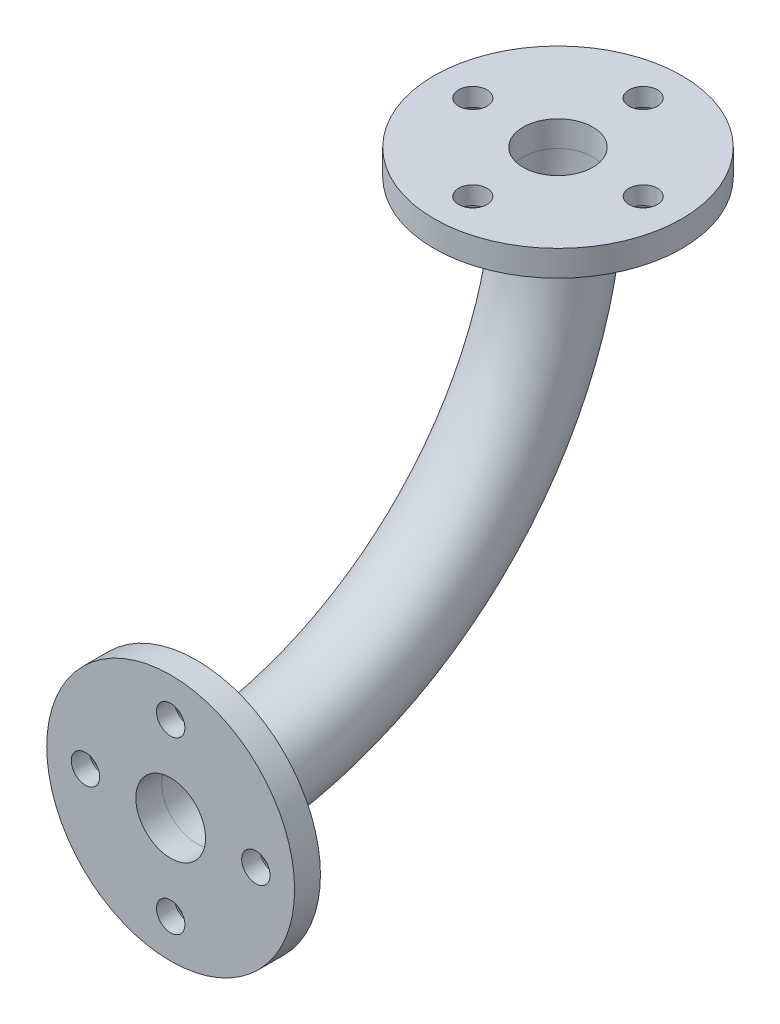
ISO-10303-21;
HEADER;
FILE_DESCRIPTION(('STEP AP214'),'2;1');
FILE_NAME('part.step','',(''),(''),'','','');
FILE_SCHEMA(('AUTOMOTIVE_DESIGN { 1 0 10303 214 1 1 1 1 }'));
ENDSEC;
DATA;
#1=APPLICATION_CONTEXT('core data for automotive mechanical design processes');
#2=APPLICATION_PROTOCOL_DEFINITION('international standard','automotive_design',2000,#1);
#3=PRODUCT_CONTEXT('',#1,'mechanical');
#4=PRODUCT('Part','Part','',(#3));
#5=PRODUCT_RELATED_PRODUCT_CATEGORY('part','',(#4));
#6=PRODUCT_DEFINITION_FORMATION('','',#4);
#7=PRODUCT_DEFINITION_CONTEXT('part definition',#1,'design');
#8=PRODUCT_DEFINITION('design','',#6,#7);
#9=PRODUCT_DEFINITION_SHAPE('','',#8);
#10=(LENGTH_UNIT() NAMED_UNIT(*) SI_UNIT(.MILLI.,.METRE.));
#11=(NAMED_UNIT(*) PLANE_ANGLE_UNIT() SI_UNIT($,.RADIAN.));
#12=(NAMED_UNIT(*) SI_UNIT($,.STERADIAN.) SOLID_ANGLE_UNIT());
#13=UNCERTAINTY_MEASURE_WITH_UNIT(LENGTH_MEASURE(1.E-05),#10,'distance_accuracy_value','');
#14=(GEOMETRIC_REPRESENTATION_CONTEXT(3) GLOBAL_UNCERTAINTY_ASSIGNED_CONTEXT((#13)) GLOBAL_UNIT_ASSIGNED_CONTEXT((#10,
#11,#12)) REPRESENTATION_CONTEXT('',''));
#15=CARTESIAN_POINT('',(0.,0.,0.));
#16=DIRECTION('',(0.,0.,1.));
#17=DIRECTION('',(1.,0.,0.));
#18=AXIS2_PLACEMENT_3D('',#15,#16,#17);
#19=CARTESIAN_POINT('',(0.,0.,-10.));
#20=DIRECTION('',(0.,0.,1.));
#21=DIRECTION('',(1.,0.,0.));
#22=AXIS2_PLACEMENT_3D('',#19,#20,#21);
#23=CYLINDRICAL_SURFACE('',#22,48.);
#24=CARTESIAN_POINT('',(0.,0.,-10.));
#25=DIRECTION('',(0.,0.,1.));
#26=DIRECTION('',(1.,0.,0.));
#27=AXIS2_PLACEMENT_3D('',#24,#25,#26);
#28=CIRCLE('',#27,48.);
#29=CARTESIAN_POINT('',(48.,0.,-10.));
#30=VERTEX_POINT('',#29);
#31=EDGE_CURVE('E47',#30,#30,#28,.T.);
#32=ORIENTED_EDGE('',*,*,#31,.T.);
#33=EDGE_LOOP('',(#32));
#34=FACE_BOUND('',#33,.T.);
#35=CARTESIAN_POINT('',(0.,0.,0.));
#36=DIRECTION('',(0.,0.,1.));
#37=DIRECTION('',(1.,0.,0.));
#38=AXIS2_PLACEMENT_3D('',#35,#36,#37);
#39=CIRCLE('',#38,48.);
#40=CARTESIAN_POINT('',(48.,0.,0.));
#41=VERTEX_POINT('',#40);
#42=EDGE_CURVE('E42',#41,#41,#39,.T.);
#43=ORIENTED_EDGE('',*,*,#42,.F.);
#44=EDGE_LOOP('',(#43));
#45=FACE_BOUND('',#44,.T.);
#46=ADVANCED_FACE('F39',(#34,#45),#23,.T.);
#47=CARTESIAN_POINT('',(0.,0.,-10.));
#48=DIRECTION('',(0.,0.,1.));
#49=DIRECTION('',(1.,0.,0.));
#50=AXIS2_PLACEMENT_3D('',#47,#48,#49);
#51=PLANE('',#50);
#52=CARTESIAN_POINT('',(0.,33.,-10.));
#53=DIRECTION('',(0.,0.,-1.));
#54=DIRECTION('',(-1.,0.,0.));
#55=AXIS2_PLACEMENT_3D('',#52,#53,#54);
#56=CIRCLE('',#55,9.);
#57=CARTESIAN_POINT('',(-9.,33.,-10.));
#58=VERTEX_POINT('',#57);
#59=EDGE_CURVE('E134',#58,#58,#56,.T.);
#60=ORIENTED_EDGE('',*,*,#59,.F.);
#61=EDGE_LOOP('',(#60));
#62=FACE_BOUND('',#61,.T.);
#63=CARTESIAN_POINT('',(-33.,0.,-10.));
#64=DIRECTION('',(0.,0.,-1.));
#65=DIRECTION('',(-1.,0.,0.));
#66=AXIS2_PLACEMENT_3D('',#63,#64,#65);
#67=CIRCLE('',#66,9.);
#68=CARTESIAN_POINT('',(-42.,0.,-10.));
#69=VERTEX_POINT('',#68);
#70=EDGE_CURVE('E118',#69,#69,#67,.T.);
#71=ORIENTED_EDGE('',*,*,#70,.F.);
#72=EDGE_LOOP('',(#71));
#73=FACE_BOUND('',#72,.T.);
#74=CARTESIAN_POINT('',(0.,-33.,-10.));
#75=DIRECTION('',(0.,0.,-1.));
#76=DIRECTION('',(-1.,0.,0.));
#77=AXIS2_PLACEMENT_3D('',#74,#75,#76);
#78=CIRCLE('',#77,9.);
#79=CARTESIAN_POINT('',(-8.99999999999999,-33.,-10.));
#80=VERTEX_POINT('',#79);
#81=EDGE_CURVE('E102',#80,#80,#78,.T.);
#82=ORIENTED_EDGE('',*,*,#81,.F.);
#83=EDGE_LOOP('',(#82));
#84=FACE_BOUND('',#83,.T.);
#85=CARTESIAN_POINT('',(33.,0.,-10.));
#86=DIRECTION('',(0.,0.,-1.));
#87=DIRECTION('',(-1.,0.,0.));
#88=AXIS2_PLACEMENT_3D('',#85,#86,#87);
#89=CIRCLE('',#88,9.);
#90=CARTESIAN_POINT('',(24.,0.,-10.));
#91=VERTEX_POINT('',#90);
#92=EDGE_CURVE('E86',#91,#91,#89,.T.);
#93=ORIENTED_EDGE('',*,*,#92,.F.);
#94=EDGE_LOOP('',(#93));
#95=FACE_BOUND('',#94,.T.);
#96=CARTESIAN_POINT('',(0.,0.,-10.));
#97=DIRECTION('',(0.,0.,-1.));
#98=DIRECTION('',(-1.,0.,0.));
#99=AXIS2_PLACEMENT_3D('',#96,#97,#98);
#100=CIRCLE('',#99,18.);
#101=CARTESIAN_POINT('',(0.,-18.,-10.));
#102=VERTEX_POINT('',#101);
#103=EDGE_CURVE('E10',#102,#102,#100,.T.);
#104=ORIENTED_EDGE('',*,*,#103,.F.);
#105=EDGE_LOOP('',(#104));
#106=FACE_BOUND('',#105,.T.);
#107=ORIENTED_EDGE('',*,*,#31,.F.);
#108=EDGE_LOOP('',(#107));
#109=FACE_BOUND('',#108,.T.);
#110=ADVANCED_FACE('F246',(#62,#73,#84,#95,#106,#109),#51,.F.);
#111=CARTESIAN_POINT('',(0.,0.,0.));
#112=DIRECTION('',(0.,0.,1.));
#113=DIRECTION('',(1.,0.,0.));
#114=AXIS2_PLACEMENT_3D('',#111,#112,#113);
#115=PLANE('',#114);
#116=CARTESIAN_POINT('',(0.,33.,0.));
#117=DIRECTION('',(0.,0.,-1.));
#118=DIRECTION('',(-1.,0.,0.));
#119=AXIS2_PLACEMENT_3D('',#116,#117,#118);
#120=CIRCLE('',#119,5.5);
#121=CARTESIAN_POINT('',(-5.5,33.,0.));
#122=VERTEX_POINT('',#121);
#123=EDGE_CURVE('E122',#122,#122,#120,.T.);
#124=ORIENTED_EDGE('',*,*,#123,.T.);
#125=EDGE_LOOP('',(#124));
#126=FACE_BOUND('',#125,.T.);
#127=CARTESIAN_POINT('',(-33.,0.,0.));
#128=DIRECTION('',(0.,0.,-1.));
#129=DIRECTION('',(-1.,0.,0.));
#130=AXIS2_PLACEMENT_3D('',#127,#128,#129);
#131=CIRCLE('',#130,5.5);
#132=CARTESIAN_POINT('',(-38.5,0.,0.));
#133=VERTEX_POINT('',#132);
#134=EDGE_CURVE('E106',#133,#133,#131,.T.);
#135=ORIENTED_EDGE('',*,*,#134,.T.);
#136=EDGE_LOOP('',(#135));
#137=FACE_BOUND('',#136,.T.);
#138=CARTESIAN_POINT('',(0.,-33.,0.));
#139=DIRECTION('',(0.,0.,-1.));
#140=DIRECTION('',(-1.,0.,0.));
#141=AXIS2_PLACEMENT_3D('',#138,#139,#140);
#142=CIRCLE('',#141,5.5);
#143=CARTESIAN_POINT('',(-5.49999999999999,-33.,0.));
#144=VERTEX_POINT('',#143);
#145=EDGE_CURVE('E90',#144,#144,#142,.T.);
#146=ORIENTED_EDGE('',*,*,#145,.T.);
#147=EDGE_LOOP('',(#146));
#148=FACE_BOUND('',#147,.T.);
#149=CARTESIAN_POINT('',(33.,0.,0.));
#150=DIRECTION('',(0.,0.,-1.));
#151=DIRECTION('',(-1.,0.,0.));
#152=AXIS2_PLACEMENT_3D('',#149,#150,#151);
#153=CIRCLE('',#152,5.5);
#154=CARTESIAN_POINT('',(27.5,0.,0.));
#155=VERTEX_POINT('',#154);
#156=EDGE_CURVE('E73',#155,#155,#153,.T.);
#157=ORIENTED_EDGE('',*,*,#156,.T.);
#158=EDGE_LOOP('',(#157));
#159=FACE_BOUND('',#158,.T.);
#160=CARTESIAN_POINT('',(0.,0.,0.));
#161=DIRECTION('',(0.,0.,1.));
#162=DIRECTION('',(1.,0.,0.));
#163=AXIS2_PLACEMENT_3D('',#160,#161,#162);
#164=CIRCLE('',#163,13.5);
#165=CARTESIAN_POINT('',(13.5,0.,0.));
#166=VERTEX_POINT('',#165);
#167=EDGE_CURVE('E61',#166,#166,#164,.T.);
#168=ORIENTED_EDGE('',*,*,#167,.F.);
#169=EDGE_LOOP('',(#168));
#170=FACE_BOUND('',#169,.T.);
#171=ORIENTED_EDGE('',*,*,#42,.T.);
#172=EDGE_LOOP('',(#171));
#173=FACE_BOUND('',#172,.T.);
#174=ADVANCED_FACE('F251',(#126,#137,#148,#159,#170,#173),#115,.T.);
#175=CARTESIAN_POINT('',(0.,0.,-10.));
#176=DIRECTION('',(0.,0.,1.));
#177=DIRECTION('',(1.,0.,0.));
#178=AXIS2_PLACEMENT_3D('',#175,#176,#177);
#179=CYLINDRICAL_SURFACE('',#178,13.5);
#180=CARTESIAN_POINT('',(0.,0.,-10.));
#181=DIRECTION('',(0.,0.,1.));
#182=DIRECTION('',(1.,0.,0.));
#183=AXIS2_PLACEMENT_3D('',#180,#181,#182);
#184=CIRCLE('',#183,13.5);
#185=CARTESIAN_POINT('',(0.,-13.5,-10.));
#186=VERTEX_POINT('',#185);
#187=EDGE_CURVE('E57',#186,#186,#184,.T.);
#188=ORIENTED_EDGE('',*,*,#187,.F.);
#189=EDGE_LOOP('',(#188));
#190=FACE_BOUND('',#189,.T.);
#191=ORIENTED_EDGE('',*,*,#167,.T.);
#192=EDGE_LOOP('',(#191));
#193=FACE_BOUND('',#192,.T.);
#194=ADVANCED_FACE('F261',(#190,#193),#179,.F.);
#195=CARTESIAN_POINT('',(0.,140.,-10.));
#196=DIRECTION('',(1.,0.,0.));
#197=DIRECTION('',(0.,0.,-1.));
#198=AXIS2_PLACEMENT_3D('',#195,#196,#197);
#199=TOROIDAL_SURFACE('',#198,140.,18.);
#200=CARTESIAN_POINT('',(0.,140.,-150.));
#201=DIRECTION('',(0.,1.,0.));
#202=DIRECTION('',(-1.,0.,0.));
#203=AXIS2_PLACEMENT_3D('',#200,#201,#202);
#204=CIRCLE('',#203,18.);
#205=CARTESIAN_POINT('',(0.,140.,-168.));
#206=VERTEX_POINT('',#205);
#207=EDGE_CURVE('E55',#206,#206,#204,.T.);
#208=CARTESIAN_POINT('',(0.,140.,-10.));
#209=DIRECTION('',(1.,0.,0.));
#210=DIRECTION('',(0.,0.,-1.));
#211=AXIS2_PLACEMENT_3D('',#208,#209,#210);
#212=CIRCLE('',#211,158.);
#213=EDGE_CURVE('',#102,#206,#212,.T.);
#214=ORIENTED_EDGE('',*,*,#103,.T.);
#215=ORIENTED_EDGE('',*,*,#207,.F.);
#216=ORIENTED_EDGE('',*,*,#213,.T.);
#217=ORIENTED_EDGE('',*,*,#213,.F.);
#218=EDGE_LOOP('',(#214,#216,#215,#217));
#219=FACE_BOUND('',#218,.T.);
#220=ADVANCED_FACE('F266',(#219),#199,.T.);
#221=CARTESIAN_POINT('',(0.,140.,-10.));
#222=DIRECTION('',(1.,0.,0.));
#223=DIRECTION('',(0.,0.,-1.));
#224=AXIS2_PLACEMENT_3D('',#221,#222,#223);
#225=TOROIDAL_SURFACE('',#224,140.,13.5);
#226=CARTESIAN_POINT('',(0.,140.,-150.));
#227=DIRECTION('',(0.,1.,0.));
#228=DIRECTION('',(-1.,0.,0.));
#229=AXIS2_PLACEMENT_3D('',#226,#227,#228);
#230=CIRCLE('',#229,13.5);
#231=CARTESIAN_POINT('',(0.,140.,-163.5));
#232=VERTEX_POINT('',#231);
#233=EDGE_CURVE('E64',#232,#232,#230,.F.);
#234=CARTESIAN_POINT('',(0.,140.,-10.));
#235=DIRECTION('',(1.,0.,0.));
#236=DIRECTION('',(0.,0.,-1.));
#237=AXIS2_PLACEMENT_3D('',#234,#235,#236);
#238=CIRCLE('',#237,153.5);
#239=EDGE_CURVE('',#186,#232,#238,.T.);
#240=ORIENTED_EDGE('',*,*,#187,.T.);
#241=ORIENTED_EDGE('',*,*,#233,.F.);
#242=ORIENTED_EDGE('',*,*,#239,.T.);
#243=ORIENTED_EDGE('',*,*,#239,.F.);
#244=EDGE_LOOP('',(#240,#242,#241,#243));
#245=FACE_BOUND('',#244,.T.);
#246=ADVANCED_FACE('F269',(#245),#225,.F.);
#247=CARTESIAN_POINT('',(33.,0.,-10.));
#248=DIRECTION('',(0.,0.,-1.));
#249=DIRECTION('',(-1.,0.,0.));
#250=AXIS2_PLACEMENT_3D('',#247,#248,#249);
#251=CYLINDRICAL_SURFACE('',#250,5.50000000000001);
#252=ORIENTED_EDGE('',*,*,#156,.F.);
#253=EDGE_LOOP('',(#252));
#254=FACE_BOUND('',#253,.T.);
#255=CARTESIAN_POINT('',(33.,0.,-7.));
#256=DIRECTION('',(0.,0.,-1.));
#257=DIRECTION('',(-1.,0.,0.));
#258=AXIS2_PLACEMENT_3D('',#255,#256,#257);
#259=CIRCLE('',#258,5.50000000000001);
#260=CARTESIAN_POINT('',(27.5,0.,-7.));
#261=VERTEX_POINT('',#260);
#262=EDGE_CURVE('E78',#261,#261,#259,.T.);
#263=ORIENTED_EDGE('',*,*,#262,.T.);
#264=EDGE_LOOP('',(#263));
#265=FACE_BOUND('',#264,.T.);
#266=ADVANCED_FACE('F275',(#254,#265),#251,.F.);
#267=CARTESIAN_POINT('',(38.5,0.,-7.));
#268=DIRECTION('',(0.,0.,1.));
#269=DIRECTION('',(1.,0.,0.));
#270=AXIS2_PLACEMENT_3D('',#267,#268,#269);
#271=PLANE('',#270);
#272=ORIENTED_EDGE('',*,*,#262,.F.);
#273=EDGE_LOOP('',(#272));
#274=FACE_BOUND('',#273,.T.);
#275=CARTESIAN_POINT('',(33.,0.,-7.));
#276=DIRECTION('',(0.,0.,-1.));
#277=DIRECTION('',(-1.,0.,0.));
#278=AXIS2_PLACEMENT_3D('',#275,#276,#277);
#279=CIRCLE('',#278,9.);
#280=CARTESIAN_POINT('',(24.,0.,-7.));
#281=VERTEX_POINT('',#280);
#282=EDGE_CURVE('E82',#281,#281,#279,.T.);
#283=ORIENTED_EDGE('',*,*,#282,.T.);
#284=EDGE_LOOP('',(#283));
#285=FACE_BOUND('',#284,.T.);
#286=ADVANCED_FACE('F281',(#274,#285),#271,.F.);
#287=CARTESIAN_POINT('',(33.,0.,-10.));
#288=DIRECTION('',(0.,0.,-1.));
#289=DIRECTION('',(-1.,0.,0.));
#290=AXIS2_PLACEMENT_3D('',#287,#288,#289);
#291=CYLINDRICAL_SURFACE('',#290,9.);
#292=ORIENTED_EDGE('',*,*,#282,.F.);
#293=EDGE_LOOP('',(#292));
#294=FACE_BOUND('',#293,.T.);
#295=ORIENTED_EDGE('',*,*,#92,.T.);
#296=EDGE_LOOP('',(#295));
#297=FACE_BOUND('',#296,.T.);
#298=ADVANCED_FACE('F285',(#294,#297),#291,.F.);
#299=CARTESIAN_POINT('',(0.,-33.,-10.));
#300=DIRECTION('',(0.,0.,-1.));
#301=DIRECTION('',(-1.,0.,0.));
#302=AXIS2_PLACEMENT_3D('',#299,#300,#301);
#303=CYLINDRICAL_SURFACE('',#302,5.50000000000001);
#304=ORIENTED_EDGE('',*,*,#145,.F.);
#305=EDGE_LOOP('',(#304));
#306=FACE_BOUND('',#305,.T.);
#307=CARTESIAN_POINT('',(0.,-33.,-7.));
#308=DIRECTION('',(0.,0.,-1.));
#309=DIRECTION('',(-1.,0.,0.));
#310=AXIS2_PLACEMENT_3D('',#307,#308,#309);
#311=CIRCLE('',#310,5.50000000000001);
#312=CARTESIAN_POINT('',(-5.50000000000001,-33.,-7.));
#313=VERTEX_POINT('',#312);
#314=EDGE_CURVE('E94',#313,#313,#311,.T.);
#315=ORIENTED_EDGE('',*,*,#314,.T.);
#316=EDGE_LOOP('',(#315));
#317=FACE_BOUND('',#316,.T.);
#318=ADVANCED_FACE('F289',(#306,#317),#303,.F.);
#319=CARTESIAN_POINT('',(5.50000000000002,-33.,-7.));
#320=DIRECTION('',(0.,0.,1.));
#321=DIRECTION('',(1.,0.,0.));
#322=AXIS2_PLACEMENT_3D('',#319,#320,#321);
#323=PLANE('',#322);
#324=ORIENTED_EDGE('',*,*,#314,.F.);
#325=EDGE_LOOP('',(#324));
#326=FACE_BOUND('',#325,.T.);
#327=CARTESIAN_POINT('',(0.,-33.,-7.));
#328=DIRECTION('',(0.,0.,-1.));
#329=DIRECTION('',(-1.,0.,0.));
#330=AXIS2_PLACEMENT_3D('',#327,#328,#329);
#331=CIRCLE('',#330,9.);
#332=CARTESIAN_POINT('',(-8.99999999999999,-33.,-7.));
#333=VERTEX_POINT('',#332);
#334=EDGE_CURVE('E98',#333,#333,#331,.T.);
#335=ORIENTED_EDGE('',*,*,#334,.T.);
#336=EDGE_LOOP('',(#335));
#337=FACE_BOUND('',#336,.T.);
#338=ADVANCED_FACE('F293',(#326,#337),#323,.F.);
#339=CARTESIAN_POINT('',(0.,-33.,-10.));
#340=DIRECTION('',(0.,0.,-1.));
#341=DIRECTION('',(-1.,0.,0.));
#342=AXIS2_PLACEMENT_3D('',#339,#340,#341);
#343=CYLINDRICAL_SURFACE('',#342,9.);
#344=ORIENTED_EDGE('',*,*,#334,.F.);
#345=EDGE_LOOP('',(#344));
#346=FACE_BOUND('',#345,.T.);
#347=ORIENTED_EDGE('',*,*,#81,.T.);
#348=EDGE_LOOP('',(#347));
#349=FACE_BOUND('',#348,.T.);
#350=ADVANCED_FACE('F297',(#346,#349),#343,.F.);
#351=CARTESIAN_POINT('',(-33.,0.,-10.));
#352=DIRECTION('',(0.,0.,-1.));
#353=DIRECTION('',(-1.,0.,0.));
#354=AXIS2_PLACEMENT_3D('',#351,#352,#353);
#355=CYLINDRICAL_SURFACE('',#354,5.50000000000001);
#356=ORIENTED_EDGE('',*,*,#134,.F.);
#357=EDGE_LOOP('',(#356));
#358=FACE_BOUND('',#357,.T.);
#359=CARTESIAN_POINT('',(-33.,0.,-7.));
#360=DIRECTION('',(0.,0.,-1.));
#361=DIRECTION('',(-1.,0.,0.));
#362=AXIS2_PLACEMENT_3D('',#359,#360,#361);
#363=CIRCLE('',#362,5.50000000000001);
#364=CARTESIAN_POINT('',(-38.5,0.,-7.));
#365=VERTEX_POINT('',#364);
#366=EDGE_CURVE('E110',#365,#365,#363,.T.);
#367=ORIENTED_EDGE('',*,*,#366,.T.);
#368=EDGE_LOOP('',(#367));
#369=FACE_BOUND('',#368,.T.);
#370=ADVANCED_FACE('F301',(#358,#369),#355,.F.);
#371=CARTESIAN_POINT('',(-27.5,0.,-7.));
#372=DIRECTION('',(0.,0.,1.));
#373=DIRECTION('',(1.,0.,0.));
#374=AXIS2_PLACEMENT_3D('',#371,#372,#373);
#375=PLANE('',#374);
#376=ORIENTED_EDGE('',*,*,#366,.F.);
#377=EDGE_LOOP('',(#376));
#378=FACE_BOUND('',#377,.T.);
#379=CARTESIAN_POINT('',(-33.,0.,-7.));
#380=DIRECTION('',(0.,0.,-1.));
#381=DIRECTION('',(-1.,0.,0.));
#382=AXIS2_PLACEMENT_3D('',#379,#380,#381);
#383=CIRCLE('',#382,9.);
#384=CARTESIAN_POINT('',(-42.,0.,-7.));
#385=VERTEX_POINT('',#384);
#386=EDGE_CURVE('E114',#385,#385,#383,.T.);
#387=ORIENTED_EDGE('',*,*,#386,.T.);
#388=EDGE_LOOP('',(#387));
#389=FACE_BOUND('',#388,.T.);
#390=ADVANCED_FACE('F305',(#378,#389),#375,.F.);
#391=CARTESIAN_POINT('',(-33.,0.,-10.));
#392=DIRECTION('',(0.,0.,-1.));
#393=DIRECTION('',(-1.,0.,0.));
#394=AXIS2_PLACEMENT_3D('',#391,#392,#393);
#395=CYLINDRICAL_SURFACE('',#394,9.);
#396=ORIENTED_EDGE('',*,*,#386,.F.);
#397=EDGE_LOOP('',(#396));
#398=FACE_BOUND('',#397,.T.);
#399=ORIENTED_EDGE('',*,*,#70,.T.);
#400=EDGE_LOOP('',(#399));
#401=FACE_BOUND('',#400,.T.);
#402=ADVANCED_FACE('F309',(#398,#401),#395,.F.);
#403=CARTESIAN_POINT('',(0.,33.,-10.));
#404=DIRECTION('',(0.,0.,-1.));
#405=DIRECTION('',(-1.,0.,0.));
#406=AXIS2_PLACEMENT_3D('',#403,#404,#405);
#407=CYLINDRICAL_SURFACE('',#406,5.50000000000001);
#408=ORIENTED_EDGE('',*,*,#123,.F.);
#409=EDGE_LOOP('',(#408));
#410=FACE_BOUND('',#409,.T.);
#411=CARTESIAN_POINT('',(0.,33.,-7.));
#412=DIRECTION('',(0.,0.,-1.));
#413=DIRECTION('',(-1.,0.,0.));
#414=AXIS2_PLACEMENT_3D('',#411,#412,#413);
#415=CIRCLE('',#414,5.50000000000001);
#416=CARTESIAN_POINT('',(-5.50000000000001,33.,-7.));
#417=VERTEX_POINT('',#416);
#418=EDGE_CURVE('E126',#417,#417,#415,.T.);
#419=ORIENTED_EDGE('',*,*,#418,.T.);
#420=EDGE_LOOP('',(#419));
#421=FACE_BOUND('',#420,.T.);
#422=ADVANCED_FACE('F313',(#410,#421),#407,.F.);
#423=CARTESIAN_POINT('',(5.50000000000001,33.,-7.));
#424=DIRECTION('',(0.,0.,1.));
#425=DIRECTION('',(1.,0.,0.));
#426=AXIS2_PLACEMENT_3D('',#423,#424,#425);
#427=PLANE('',#426);
#428=ORIENTED_EDGE('',*,*,#418,.F.);
#429=EDGE_LOOP('',(#428));
#430=FACE_BOUND('',#429,.T.);
#431=CARTESIAN_POINT('',(0.,33.,-7.));
#432=DIRECTION('',(0.,0.,-1.));
#433=DIRECTION('',(-1.,0.,0.));
#434=AXIS2_PLACEMENT_3D('',#431,#432,#433);
#435=CIRCLE('',#434,9.);
#436=CARTESIAN_POINT('',(-9.,33.,-7.));
#437=VERTEX_POINT('',#436);
#438=EDGE_CURVE('E130',#437,#437,#435,.T.);
#439=ORIENTED_EDGE('',*,*,#438,.T.);
#440=EDGE_LOOP('',(#439));
#441=FACE_BOUND('',#440,.T.);
#442=ADVANCED_FACE('F317',(#430,#441),#427,.F.);
#443=CARTESIAN_POINT('',(0.,33.,-10.));
#444=DIRECTION('',(0.,0.,-1.));
#445=DIRECTION('',(-1.,0.,0.));
#446=AXIS2_PLACEMENT_3D('',#443,#444,#445);
#447=CYLINDRICAL_SURFACE('',#446,9.);
#448=ORIENTED_EDGE('',*,*,#438,.F.);
#449=EDGE_LOOP('',(#448));
#450=FACE_BOUND('',#449,.T.);
#451=ORIENTED_EDGE('',*,*,#59,.T.);
#452=EDGE_LOOP('',(#451));
#453=FACE_BOUND('',#452,.T.);
#454=ADVANCED_FACE('F320',(#450,#453),#447,.F.);
#455=CARTESIAN_POINT('',(0.,150.,-150.));
#456=DIRECTION('',(0.,1.,0.));
#457=DIRECTION('',(0.,0.,1.));
#458=AXIS2_PLACEMENT_3D('',#455,#456,#457);
#459=PLANE('',#458);
#460=CARTESIAN_POINT('',(0.,150.,-117.));
#461=DIRECTION('',(0.,-1.,0.));
#462=DIRECTION('',(0.,0.,-1.));
#463=AXIS2_PLACEMENT_3D('',#460,#461,#462);
#464=CIRCLE('',#463,5.5);
#465=CARTESIAN_POINT('',(0.,150.,-122.5));
#466=VERTEX_POINT('',#465);
#467=EDGE_CURVE('E198',#466,#466,#464,.T.);
#468=ORIENTED_EDGE('',*,*,#467,.T.);
#469=EDGE_LOOP('',(#468));
#470=FACE_BOUND('',#469,.T.);
#471=CARTESIAN_POINT('',(-33.,150.,-150.));
#472=DIRECTION('',(0.,-1.,0.));
#473=DIRECTION('',(0.,0.,-1.));
#474=AXIS2_PLACEMENT_3D('',#471,#472,#473);
#475=CIRCLE('',#474,5.5);
#476=CARTESIAN_POINT('',(-33.,150.,-155.5));
#477=VERTEX_POINT('',#476);
#478=EDGE_CURVE('E182',#477,#477,#475,.T.);
#479=ORIENTED_EDGE('',*,*,#478,.T.);
#480=EDGE_LOOP('',(#479));
#481=FACE_BOUND('',#480,.T.);
#482=CARTESIAN_POINT('',(0.,150.,-183.));
#483=DIRECTION('',(0.,-1.,0.));
#484=DIRECTION('',(0.,0.,-1.));
#485=AXIS2_PLACEMENT_3D('',#482,#483,#484);
#486=CIRCLE('',#485,5.5);
#487=CARTESIAN_POINT('',(0.,150.,-188.5));
#488=VERTEX_POINT('',#487);
#489=EDGE_CURVE('E166',#488,#488,#486,.T.);
#490=ORIENTED_EDGE('',*,*,#489,.T.);
#491=EDGE_LOOP('',(#490));
#492=FACE_BOUND('',#491,.T.);
#493=CARTESIAN_POINT('',(33.,150.,-150.));
#494=DIRECTION('',(0.,-1.,0.));
#495=DIRECTION('',(0.,0.,-1.));
#496=AXIS2_PLACEMENT_3D('',#493,#494,#495);
#497=CIRCLE('',#496,5.5);
#498=CARTESIAN_POINT('',(33.,150.,-155.5));
#499=VERTEX_POINT('',#498);
#500=EDGE_CURVE('E150',#499,#499,#497,.T.);
#501=ORIENTED_EDGE('',*,*,#500,.T.);
#502=EDGE_LOOP('',(#501));
#503=FACE_BOUND('',#502,.T.);
#504=CARTESIAN_POINT('',(0.,150.,-150.));
#505=DIRECTION('',(0.,1.,0.));
#506=DIRECTION('',(0.,0.,1.));
#507=AXIS2_PLACEMENT_3D('',#504,#505,#506);
#508=CIRCLE('',#507,48.);
#509=CARTESIAN_POINT('',(0.,150.,-102.));
#510=VERTEX_POINT('',#509);
#511=EDGE_CURVE('E138',#510,#510,#508,.T.);
#512=ORIENTED_EDGE('',*,*,#511,.T.);
#513=EDGE_LOOP('',(#512));
#514=FACE_BOUND('',#513,.T.);
#515=CARTESIAN_POINT('',(0.,150.,-150.));
#516=DIRECTION('',(0.,1.,0.));
#517=DIRECTION('',(0.,0.,1.));
#518=AXIS2_PLACEMENT_3D('',#515,#516,#517);
#519=CIRCLE('',#518,13.5);
#520=CARTESIAN_POINT('',(0.,150.,-136.5));
#521=VERTEX_POINT('',#520);
#522=EDGE_CURVE('E143',#521,#521,#519,.T.);
#523=ORIENTED_EDGE('',*,*,#522,.F.);
#524=EDGE_LOOP('',(#523));
#525=FACE_BOUND('',#524,.T.);
#526=ADVANCED_FACE('F221',(#470,#481,#492,#503,#514,#525),#459,.T.);
#527=CARTESIAN_POINT('',(0.,140.,-150.));
#528=DIRECTION('',(0.,1.,0.));
#529=DIRECTION('',(0.,0.,1.));
#530=AXIS2_PLACEMENT_3D('',#527,#528,#529);
#531=PLANE('',#530);
#532=CARTESIAN_POINT('',(0.,140.,-117.));
#533=DIRECTION('',(0.,-1.,0.));
#534=DIRECTION('',(0.,0.,-1.));
#535=AXIS2_PLACEMENT_3D('',#532,#533,#534);
#536=CIRCLE('',#535,9.);
#537=CARTESIAN_POINT('',(0.,140.,-126.));
#538=VERTEX_POINT('',#537);
#539=EDGE_CURVE('E210',#538,#538,#536,.T.);
#540=ORIENTED_EDGE('',*,*,#539,.F.);
#541=EDGE_LOOP('',(#540));
#542=FACE_BOUND('',#541,.T.);
#543=CARTESIAN_POINT('',(-33.,140.,-150.));
#544=DIRECTION('',(0.,-1.,0.));
#545=DIRECTION('',(0.,0.,-1.));
#546=AXIS2_PLACEMENT_3D('',#543,#544,#545);
#547=CIRCLE('',#546,9.);
#548=CARTESIAN_POINT('',(-33.,140.,-159.));
#549=VERTEX_POINT('',#548);
#550=EDGE_CURVE('E194',#549,#549,#547,.T.);
#551=ORIENTED_EDGE('',*,*,#550,.F.);
#552=EDGE_LOOP('',(#551));
#553=FACE_BOUND('',#552,.T.);
#554=CARTESIAN_POINT('',(0.,140.,-183.));
#555=DIRECTION('',(0.,-1.,0.));
#556=DIRECTION('',(0.,0.,-1.));
#557=AXIS2_PLACEMENT_3D('',#554,#555,#556);
#558=CIRCLE('',#557,9.);
#559=CARTESIAN_POINT('',(0.,140.,-192.));
#560=VERTEX_POINT('',#559);
#561=EDGE_CURVE('E178',#560,#560,#558,.T.);
#562=ORIENTED_EDGE('',*,*,#561,.F.);
#563=EDGE_LOOP('',(#562));
#564=FACE_BOUND('',#563,.T.);
#565=CARTESIAN_POINT('',(33.,140.,-150.));
#566=DIRECTION('',(0.,-1.,0.));
#567=DIRECTION('',(0.,0.,-1.));
#568=AXIS2_PLACEMENT_3D('',#565,#566,#567);
#569=CIRCLE('',#568,9.);
#570=CARTESIAN_POINT('',(33.,140.,-159.));
#571=VERTEX_POINT('',#570);
#572=EDGE_CURVE('E162',#571,#571,#569,.T.);
#573=ORIENTED_EDGE('',*,*,#572,.F.);
#574=EDGE_LOOP('',(#573));
#575=FACE_BOUND('',#574,.T.);
#576=ORIENTED_EDGE('',*,*,#207,.T.);
#577=EDGE_LOOP('',(#576));
#578=FACE_BOUND('',#577,.T.);
#579=CARTESIAN_POINT('',(0.,140.,-150.));
#580=DIRECTION('',(0.,1.,0.));
#581=DIRECTION('',(0.,0.,1.));
#582=AXIS2_PLACEMENT_3D('',#579,#580,#581);
#583=CIRCLE('',#582,48.);
#584=CARTESIAN_POINT('',(0.,140.,-102.));
#585=VERTEX_POINT('',#584);
#586=EDGE_CURVE('E139',#585,#585,#583,.T.);
#587=ORIENTED_EDGE('',*,*,#586,.F.);
#588=EDGE_LOOP('',(#587));
#589=FACE_BOUND('',#588,.T.);
#590=ADVANCED_FACE('F217',(#542,#553,#564,#575,#578,#589),#531,.F.);
#591=CARTESIAN_POINT('',(0.,150.,-150.));
#592=DIRECTION('',(0.,-1.,0.));
#593=DIRECTION('',(0.,0.,-1.));
#594=AXIS2_PLACEMENT_3D('',#591,#592,#593);
#595=CYLINDRICAL_SURFACE('',#594,48.);
#596=ORIENTED_EDGE('',*,*,#511,.F.);
#597=EDGE_LOOP('',(#596));
#598=FACE_BOUND('',#597,.T.);
#599=ORIENTED_EDGE('',*,*,#586,.T.);
#600=EDGE_LOOP('',(#599));
#601=FACE_BOUND('',#600,.T.);
#602=ADVANCED_FACE('F220',(#598,#601),#595,.T.);
#603=CARTESIAN_POINT('',(0.,150.,-150.));
#604=DIRECTION('',(0.,-1.,0.));
#605=DIRECTION('',(0.,0.,-1.));
#606=AXIS2_PLACEMENT_3D('',#603,#604,#605);
#607=CYLINDRICAL_SURFACE('',#606,13.5);
#608=ORIENTED_EDGE('',*,*,#522,.T.);
#609=EDGE_LOOP('',(#608));
#610=FACE_BOUND('',#609,.T.);
#611=ORIENTED_EDGE('',*,*,#233,.T.);
#612=EDGE_LOOP('',(#611));
#613=FACE_BOUND('',#612,.T.);
#614=ADVANCED_FACE('F234',(#610,#613),#607,.F.);
#615=CARTESIAN_POINT('',(33.,140.,-150.));
#616=DIRECTION('',(0.,-1.,0.));
#617=DIRECTION('',(0.,0.,-1.));
#618=AXIS2_PLACEMENT_3D('',#615,#616,#617);
#619=CYLINDRICAL_SURFACE('',#618,5.5);
#620=ORIENTED_EDGE('',*,*,#500,.F.);
#621=EDGE_LOOP('',(#620));
#622=FACE_BOUND('',#621,.T.);
#623=CARTESIAN_POINT('',(33.,143.,-150.));
#624=DIRECTION('',(0.,-1.,0.));
#625=DIRECTION('',(0.,0.,-1.));
#626=AXIS2_PLACEMENT_3D('',#623,#624,#625);
#627=CIRCLE('',#626,5.5);
#628=CARTESIAN_POINT('',(33.,143.,-155.5));
#629=VERTEX_POINT('',#628);
#630=EDGE_CURVE('E154',#629,#629,#627,.T.);
#631=ORIENTED_EDGE('',*,*,#630,.T.);
#632=EDGE_LOOP('',(#631));
#633=FACE_BOUND('',#632,.T.);
#634=ADVANCED_FACE('F240',(#622,#633),#619,.F.);
#635=CARTESIAN_POINT('',(38.5,143.,-150.));
#636=DIRECTION('',(0.,1.,0.));
#637=DIRECTION('',(0.,0.,1.));
#638=AXIS2_PLACEMENT_3D('',#635,#636,#637);
#639=PLANE('',#638);
#640=ORIENTED_EDGE('',*,*,#630,.F.);
#641=EDGE_LOOP('',(#640));
#642=FACE_BOUND('',#641,.T.);
#643=CARTESIAN_POINT('',(33.,143.,-150.));
#644=DIRECTION('',(0.,-1.,0.));
#645=DIRECTION('',(0.,0.,-1.));
#646=AXIS2_PLACEMENT_3D('',#643,#644,#645);
#647=CIRCLE('',#646,8.99999999999999);
#648=CARTESIAN_POINT('',(33.,143.,-159.));
#649=VERTEX_POINT('',#648);
#650=EDGE_CURVE('E158',#649,#649,#647,.T.);
#651=ORIENTED_EDGE('',*,*,#650,.T.);
#652=EDGE_LOOP('',(#651));
#653=FACE_BOUND('',#652,.T.);
#654=ADVANCED_FACE('F350',(#642,#653),#639,.F.);
#655=CARTESIAN_POINT('',(33.,140.,-150.));
#656=DIRECTION('',(0.,-1.,0.));
#657=DIRECTION('',(0.,0.,-1.));
#658=AXIS2_PLACEMENT_3D('',#655,#656,#657);
#659=CYLINDRICAL_SURFACE('',#658,9.);
#660=ORIENTED_EDGE('',*,*,#650,.F.);
#661=EDGE_LOOP('',(#660));
#662=FACE_BOUND('',#661,.T.);
#663=ORIENTED_EDGE('',*,*,#572,.T.);
#664=EDGE_LOOP('',(#663));
#665=FACE_BOUND('',#664,.T.);
#666=ADVANCED_FACE('F354',(#662,#665),#659,.F.);
#667=CARTESIAN_POINT('',(0.,140.,-183.));
#668=DIRECTION('',(0.,-1.,0.));
#669=DIRECTION('',(0.,0.,-1.));
#670=AXIS2_PLACEMENT_3D('',#667,#668,#669);
#671=CYLINDRICAL_SURFACE('',#670,5.5);
#672=ORIENTED_EDGE('',*,*,#489,.F.);
#673=EDGE_LOOP('',(#672));
#674=FACE_BOUND('',#673,.T.);
#675=CARTESIAN_POINT('',(0.,143.,-183.));
#676=DIRECTION('',(0.,-1.,0.));
#677=DIRECTION('',(0.,0.,-1.));
#678=AXIS2_PLACEMENT_3D('',#675,#676,#677);
#679=CIRCLE('',#678,5.5);
#680=CARTESIAN_POINT('',(0.,143.,-188.5));
#681=VERTEX_POINT('',#680);
#682=EDGE_CURVE('E170',#681,#681,#679,.T.);
#683=ORIENTED_EDGE('',*,*,#682,.T.);
#684=EDGE_LOOP('',(#683));
#685=FACE_BOUND('',#684,.T.);
#686=ADVANCED_FACE('F358',(#674,#685),#671,.F.);
#687=CARTESIAN_POINT('',(5.50000000000001,143.,-183.));
#688=DIRECTION('',(0.,1.,0.));
#689=DIRECTION('',(0.,0.,1.));
#690=AXIS2_PLACEMENT_3D('',#687,#688,#689);
#691=PLANE('',#690);
#692=ORIENTED_EDGE('',*,*,#682,.F.);
#693=EDGE_LOOP('',(#692));
#694=FACE_BOUND('',#693,.T.);
#695=CARTESIAN_POINT('',(0.,143.,-183.));
#696=DIRECTION('',(0.,-1.,0.));
#697=DIRECTION('',(0.,0.,-1.));
#698=AXIS2_PLACEMENT_3D('',#695,#696,#697);
#699=CIRCLE('',#698,9.);
#700=CARTESIAN_POINT('',(0.,143.,-192.));
#701=VERTEX_POINT('',#700);
#702=EDGE_CURVE('E174',#701,#701,#699,.T.);
#703=ORIENTED_EDGE('',*,*,#702,.T.);
#704=EDGE_LOOP('',(#703));
#705=FACE_BOUND('',#704,.T.);
#706=ADVANCED_FACE('F362',(#694,#705),#691,.F.);
#707=CARTESIAN_POINT('',(0.,140.,-183.));
#708=DIRECTION('',(0.,-1.,0.));
#709=DIRECTION('',(0.,0.,-1.));
#710=AXIS2_PLACEMENT_3D('',#707,#708,#709);
#711=CYLINDRICAL_SURFACE('',#710,9.);
#712=ORIENTED_EDGE('',*,*,#702,.F.);
#713=EDGE_LOOP('',(#712));
#714=FACE_BOUND('',#713,.T.);
#715=ORIENTED_EDGE('',*,*,#561,.T.);
#716=EDGE_LOOP('',(#715));
#717=FACE_BOUND('',#716,.T.);
#718=ADVANCED_FACE('F366',(#714,#717),#711,.F.);
#719=CARTESIAN_POINT('',(-33.,140.,-150.));
#720=DIRECTION('',(0.,-1.,0.));
#721=DIRECTION('',(0.,0.,-1.));
#722=AXIS2_PLACEMENT_3D('',#719,#720,#721);
#723=CYLINDRICAL_SURFACE('',#722,5.5);
#724=ORIENTED_EDGE('',*,*,#478,.F.);
#725=EDGE_LOOP('',(#724));
#726=FACE_BOUND('',#725,.T.);
#727=CARTESIAN_POINT('',(-33.,143.,-150.));
#728=DIRECTION('',(0.,-1.,0.));
#729=DIRECTION('',(0.,0.,-1.));
#730=AXIS2_PLACEMENT_3D('',#727,#728,#729);
#731=CIRCLE('',#730,5.5);
#732=CARTESIAN_POINT('',(-33.,143.,-155.5));
#733=VERTEX_POINT('',#732);
#734=EDGE_CURVE('E186',#733,#733,#731,.T.);
#735=ORIENTED_EDGE('',*,*,#734,.T.);
#736=EDGE_LOOP('',(#735));
#737=FACE_BOUND('',#736,.T.);
#738=ADVANCED_FACE('F370',(#726,#737),#723,.F.);
#739=CARTESIAN_POINT('',(-27.5,143.,-150.));
#740=DIRECTION('',(0.,1.,0.));
#741=DIRECTION('',(0.,0.,1.));
#742=AXIS2_PLACEMENT_3D('',#739,#740,#741);
#743=PLANE('',#742);
#744=ORIENTED_EDGE('',*,*,#734,.F.);
#745=EDGE_LOOP('',(#744));
#746=FACE_BOUND('',#745,.T.);
#747=CARTESIAN_POINT('',(-33.,143.,-150.));
#748=DIRECTION('',(0.,-1.,0.));
#749=DIRECTION('',(0.,0.,-1.));
#750=AXIS2_PLACEMENT_3D('',#747,#748,#749);
#751=CIRCLE('',#750,9.);
#752=CARTESIAN_POINT('',(-33.,143.,-159.));
#753=VERTEX_POINT('',#752);
#754=EDGE_CURVE('E190',#753,#753,#751,.T.);
#755=ORIENTED_EDGE('',*,*,#754,.T.);
#756=EDGE_LOOP('',(#755));
#757=FACE_BOUND('',#756,.T.);
#758=ADVANCED_FACE('F374',(#746,#757),#743,.F.);
#759=CARTESIAN_POINT('',(-33.,140.,-150.));
#760=DIRECTION('',(0.,-1.,0.));
#761=DIRECTION('',(0.,0.,-1.));
#762=AXIS2_PLACEMENT_3D('',#759,#760,#761);
#763=CYLINDRICAL_SURFACE('',#762,9.);
#764=ORIENTED_EDGE('',*,*,#754,.F.);
#765=EDGE_LOOP('',(#764));
#766=FACE_BOUND('',#765,.T.);
#767=ORIENTED_EDGE('',*,*,#550,.T.);
#768=EDGE_LOOP('',(#767));
#769=FACE_BOUND('',#768,.T.);
#770=ADVANCED_FACE('F378',(#766,#769),#763,.F.);
#771=CARTESIAN_POINT('',(0.,140.,-117.));
#772=DIRECTION('',(0.,-1.,0.));
#773=DIRECTION('',(0.,0.,-1.));
#774=AXIS2_PLACEMENT_3D('',#771,#772,#773);
#775=CYLINDRICAL_SURFACE('',#774,5.5);
#776=ORIENTED_EDGE('',*,*,#467,.F.);
#777=EDGE_LOOP('',(#776));
#778=FACE_BOUND('',#777,.T.);
#779=CARTESIAN_POINT('',(0.,143.,-117.));
#780=DIRECTION('',(0.,-1.,0.));
#781=DIRECTION('',(0.,0.,-1.));
#782=AXIS2_PLACEMENT_3D('',#779,#780,#781);
#783=CIRCLE('',#782,5.5);
#784=CARTESIAN_POINT('',(0.,143.,-122.5));
#785=VERTEX_POINT('',#784);
#786=EDGE_CURVE('E202',#785,#785,#783,.T.);
#787=ORIENTED_EDGE('',*,*,#786,.T.);
#788=EDGE_LOOP('',(#787));
#789=FACE_BOUND('',#788,.T.);
#790=ADVANCED_FACE('F382',(#778,#789),#775,.F.);
#791=CARTESIAN_POINT('',(5.5,143.,-117.));
#792=DIRECTION('',(0.,1.,0.));
#793=DIRECTION('',(0.,0.,1.));
#794=AXIS2_PLACEMENT_3D('',#791,#792,#793);
#795=PLANE('',#794);
#796=ORIENTED_EDGE('',*,*,#786,.F.);
#797=EDGE_LOOP('',(#796));
#798=FACE_BOUND('',#797,.T.);
#799=CARTESIAN_POINT('',(0.,143.,-117.));
#800=DIRECTION('',(0.,-1.,0.));
#801=DIRECTION('',(0.,0.,-1.));
#802=AXIS2_PLACEMENT_3D('',#799,#800,#801);
#803=CIRCLE('',#802,9.);
#804=CARTESIAN_POINT('',(0.,143.,-126.));
#805=VERTEX_POINT('',#804);
#806=EDGE_CURVE('E206',#805,#805,#803,.T.);
#807=ORIENTED_EDGE('',*,*,#806,.T.);
#808=EDGE_LOOP('',(#807));
#809=FACE_BOUND('',#808,.T.);
#810=ADVANCED_FACE('F386',(#798,#809),#795,.F.);
#811=CARTESIAN_POINT('',(0.,140.,-117.));
#812=DIRECTION('',(0.,-1.,0.));
#813=DIRECTION('',(0.,0.,-1.));
#814=AXIS2_PLACEMENT_3D('',#811,#812,#813);
#815=CYLINDRICAL_SURFACE('',#814,9.);
#816=ORIENTED_EDGE('',*,*,#806,.F.);
#817=EDGE_LOOP('',(#816));
#818=FACE_BOUND('',#817,.T.);
#819=ORIENTED_EDGE('',*,*,#539,.T.);
#820=EDGE_LOOP('',(#819));
#821=FACE_BOUND('',#820,.T.);
#822=ADVANCED_FACE('F215',(#818,#821),#815,.F.);
#823=CLOSED_SHELL('',(#46,#110,#174,#194,#220,#246,#266,#286,#298,#318,#338,#350,#370,#390,#402,
#422,#442,#454,#526,#590,#602,#614,#634,#654,#666,#686,#706,#718,#738,#758,#770,#790,#810,#822));
#824=MANIFOLD_SOLID_BREP('B2',#823);
#825=ADVANCED_BREP_SHAPE_REPRESENTATION('',(#18,#824),#14);
#826=SHAPE_DEFINITION_REPRESENTATION(#9,#825);
ENDSEC;
END-ISO-10303-21;
